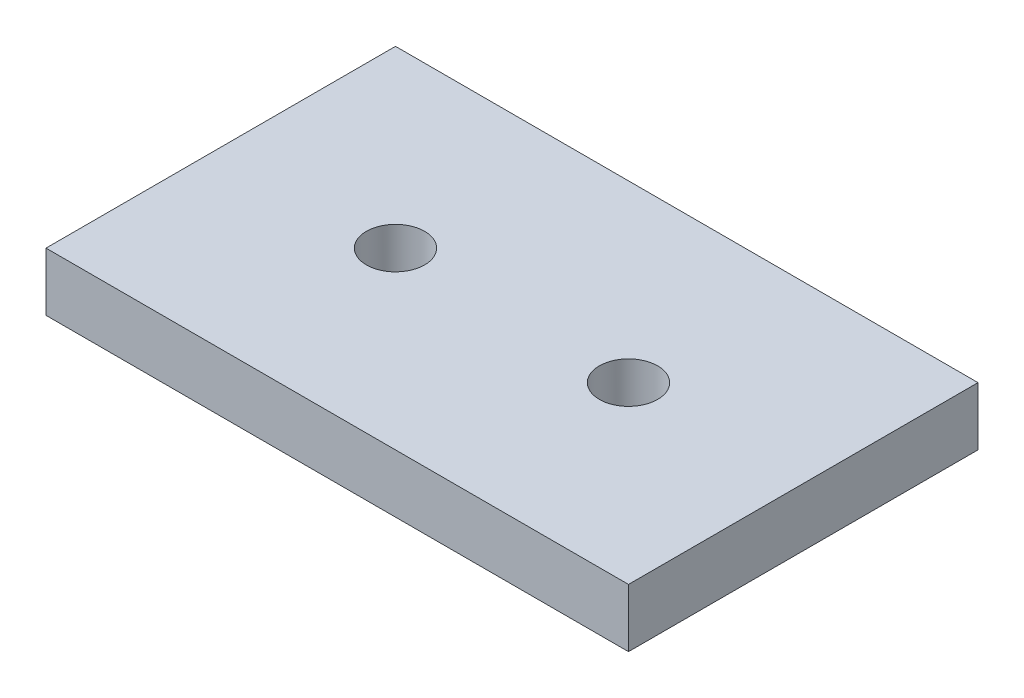
ISO-10303-21;
HEADER;
FILE_DESCRIPTION(('STEP AP214'),'2;1');
FILE_NAME('part.step','',(''),(''),'','','');
FILE_SCHEMA(('AUTOMOTIVE_DESIGN { 1 0 10303 214 1 1 1 1 }'));
ENDSEC;
DATA;
#1=APPLICATION_CONTEXT('core data for automotive mechanical design processes');
#2=APPLICATION_PROTOCOL_DEFINITION('international standard','automotive_design',2000,#1);
#3=PRODUCT_CONTEXT('',#1,'mechanical');
#4=PRODUCT('Part','Part','',(#3));
#5=PRODUCT_RELATED_PRODUCT_CATEGORY('part','',(#4));
#6=PRODUCT_DEFINITION_FORMATION('','',#4);
#7=PRODUCT_DEFINITION_CONTEXT('part definition',#1,'design');
#8=PRODUCT_DEFINITION('design','',#6,#7);
#9=PRODUCT_DEFINITION_SHAPE('','',#8);
#10=(LENGTH_UNIT() NAMED_UNIT(*) SI_UNIT(.MILLI.,.METRE.));
#11=(NAMED_UNIT(*) PLANE_ANGLE_UNIT() SI_UNIT($,.RADIAN.));
#12=(NAMED_UNIT(*) SI_UNIT($,.STERADIAN.) SOLID_ANGLE_UNIT());
#13=UNCERTAINTY_MEASURE_WITH_UNIT(LENGTH_MEASURE(1.E-05),#10,'distance_accuracy_value','');
#14=(GEOMETRIC_REPRESENTATION_CONTEXT(3) GLOBAL_UNCERTAINTY_ASSIGNED_CONTEXT((#13)) GLOBAL_UNIT_ASSIGNED_CONTEXT((#10,
#11,#12)) REPRESENTATION_CONTEXT('',''));
#15=CARTESIAN_POINT('',(0.,0.,0.));
#16=DIRECTION('',(0.,0.,1.));
#17=DIRECTION('',(1.,0.,0.));
#18=AXIS2_PLACEMENT_3D('',#15,#16,#17);
#19=CARTESIAN_POINT('',(50.,10.,30.));
#20=DIRECTION('',(-1.,0.,0.));
#21=DIRECTION('',(0.,0.,1.));
#22=AXIS2_PLACEMENT_3D('',#19,#20,#21);
#23=PLANE('',#22);
#24=DIRECTION('',(0.,0.,-1.));
#25=VECTOR('',#24,1.);
#26=CARTESIAN_POINT('',(50.,0.,30.));
#27=LINE('',#26,#25);
#28=CARTESIAN_POINT('',(50.,0.,30.));
#29=VERTEX_POINT('',#28);
#30=CARTESIAN_POINT('',(50.,0.,-30.));
#31=VERTEX_POINT('',#30);
#32=EDGE_CURVE('E102',#29,#31,#27,.T.);
#33=ORIENTED_EDGE('',*,*,#32,.T.);
#34=DIRECTION('',(0.,-1.,0.));
#35=VECTOR('',#34,1.);
#36=CARTESIAN_POINT('',(50.,10.,-30.));
#37=LINE('',#36,#35);
#38=CARTESIAN_POINT('',(50.,10.,-30.));
#39=VERTEX_POINT('',#38);
#40=EDGE_CURVE('E11',#39,#31,#37,.T.);
#41=ORIENTED_EDGE('',*,*,#40,.F.);
#42=DIRECTION('',(0.,0.,-1.));
#43=VECTOR('',#42,1.);
#44=CARTESIAN_POINT('',(50.,10.,30.));
#45=LINE('',#44,#43);
#46=CARTESIAN_POINT('',(50.,10.,30.));
#47=VERTEX_POINT('',#46);
#48=EDGE_CURVE('E90',#47,#39,#45,.T.);
#49=ORIENTED_EDGE('',*,*,#48,.F.);
#50=DIRECTION('',(0.,-1.,0.));
#51=VECTOR('',#50,1.);
#52=CARTESIAN_POINT('',(50.,10.,30.));
#53=LINE('',#52,#51);
#54=EDGE_CURVE('E98',#47,#29,#53,.T.);
#55=ORIENTED_EDGE('',*,*,#54,.T.);
#56=EDGE_LOOP('',(#33,#41,#49,#55));
#57=FACE_BOUND('',#56,.T.);
#58=ADVANCED_FACE('F39',(#57),#23,.F.);
#59=CARTESIAN_POINT('',(-50.,10.,-30.));
#60=DIRECTION('',(0.,0.,1.));
#61=DIRECTION('',(1.,0.,0.));
#62=AXIS2_PLACEMENT_3D('',#59,#60,#61);
#63=PLANE('',#62);
#64=DIRECTION('',(-1.,0.,0.));
#65=VECTOR('',#64,1.);
#66=CARTESIAN_POINT('',(-50.,0.,-30.));
#67=LINE('',#66,#65);
#68=CARTESIAN_POINT('',(-50.,0.,-30.));
#69=VERTEX_POINT('',#68);
#70=EDGE_CURVE('E94',#31,#69,#67,.T.);
#71=ORIENTED_EDGE('',*,*,#70,.T.);
#72=DIRECTION('',(0.,-1.,0.));
#73=VECTOR('',#72,1.);
#74=CARTESIAN_POINT('',(-50.,10.,-30.));
#75=LINE('',#74,#73);
#76=CARTESIAN_POINT('',(-50.,10.,-30.));
#77=VERTEX_POINT('',#76);
#78=EDGE_CURVE('E47',#77,#69,#75,.T.);
#79=ORIENTED_EDGE('',*,*,#78,.F.);
#80=DIRECTION('',(-1.,0.,0.));
#81=VECTOR('',#80,1.);
#82=CARTESIAN_POINT('',(-50.,10.,-30.));
#83=LINE('',#82,#81);
#84=EDGE_CURVE('E85',#39,#77,#83,.T.);
#85=ORIENTED_EDGE('',*,*,#84,.F.);
#86=ORIENTED_EDGE('',*,*,#40,.T.);
#87=EDGE_LOOP('',(#71,#79,#85,#86));
#88=FACE_BOUND('',#87,.T.);
#89=ADVANCED_FACE('F93',(#88),#63,.F.);
#90=CARTESIAN_POINT('',(-50.,10.,30.));
#91=DIRECTION('',(1.,0.,0.));
#92=DIRECTION('',(0.,0.,-1.));
#93=AXIS2_PLACEMENT_3D('',#90,#91,#92);
#94=PLANE('',#93);
#95=DIRECTION('',(0.,0.,1.));
#96=VECTOR('',#95,1.);
#97=CARTESIAN_POINT('',(-50.,0.,30.));
#98=LINE('',#97,#96);
#99=CARTESIAN_POINT('',(-50.,0.,30.));
#100=VERTEX_POINT('',#99);
#101=EDGE_CURVE('E72',#69,#100,#98,.T.);
#102=ORIENTED_EDGE('',*,*,#101,.T.);
#103=DIRECTION('',(0.,-1.,0.));
#104=VECTOR('',#103,1.);
#105=CARTESIAN_POINT('',(-50.,10.,30.));
#106=LINE('',#105,#104);
#107=CARTESIAN_POINT('',(-50.,10.,30.));
#108=VERTEX_POINT('',#107);
#109=EDGE_CURVE('E95',#108,#100,#106,.T.);
#110=ORIENTED_EDGE('',*,*,#109,.F.);
#111=DIRECTION('',(0.,0.,1.));
#112=VECTOR('',#111,1.);
#113=CARTESIAN_POINT('',(-50.,10.,30.));
#114=LINE('',#113,#112);
#115=EDGE_CURVE('E88',#77,#108,#114,.T.);
#116=ORIENTED_EDGE('',*,*,#115,.F.);
#117=ORIENTED_EDGE('',*,*,#78,.T.);
#118=EDGE_LOOP('',(#102,#110,#116,#117));
#119=FACE_BOUND('',#118,.T.);
#120=ADVANCED_FACE('F96',(#119),#94,.F.);
#121=CARTESIAN_POINT('',(-50.,10.,30.));
#122=DIRECTION('',(0.,0.,-1.));
#123=DIRECTION('',(-1.,0.,0.));
#124=AXIS2_PLACEMENT_3D('',#121,#122,#123);
#125=PLANE('',#124);
#126=DIRECTION('',(1.,0.,0.));
#127=VECTOR('',#126,1.);
#128=CARTESIAN_POINT('',(-50.,0.,30.));
#129=LINE('',#128,#127);
#130=EDGE_CURVE('E78',#100,#29,#129,.T.);
#131=ORIENTED_EDGE('',*,*,#130,.T.);
#132=ORIENTED_EDGE('',*,*,#54,.F.);
#133=DIRECTION('',(1.,0.,0.));
#134=VECTOR('',#133,1.);
#135=CARTESIAN_POINT('',(-50.,10.,30.));
#136=LINE('',#135,#134);
#137=EDGE_CURVE('E55',#108,#47,#136,.T.);
#138=ORIENTED_EDGE('',*,*,#137,.F.);
#139=ORIENTED_EDGE('',*,*,#109,.T.);
#140=EDGE_LOOP('',(#131,#132,#138,#139));
#141=FACE_BOUND('',#140,.T.);
#142=ADVANCED_FACE('F110',(#141),#125,.F.);
#143=CARTESIAN_POINT('',(0.,10.,0.));
#144=DIRECTION('',(0.,-1.,0.));
#145=DIRECTION('',(0.,0.,-1.));
#146=AXIS2_PLACEMENT_3D('',#143,#144,#145);
#147=PLANE('',#146);
#148=CARTESIAN_POINT('',(20.,10.,0.));
#149=DIRECTION('',(0.,-1.,0.));
#150=DIRECTION('',(0.,0.,-1.));
#151=AXIS2_PLACEMENT_3D('',#148,#149,#150);
#152=CIRCLE('',#151,5.);
#153=CARTESIAN_POINT('',(20.,10.,-5.));
#154=VERTEX_POINT('',#153);
#155=EDGE_CURVE('E121',#154,#154,#152,.F.);
#156=ORIENTED_EDGE('',*,*,#155,.F.);
#157=EDGE_LOOP('',(#156));
#158=FACE_BOUND('',#157,.T.);
#159=CARTESIAN_POINT('',(-20.,10.,0.));
#160=DIRECTION('',(0.,-1.,0.));
#161=DIRECTION('',(0.,0.,-1.));
#162=AXIS2_PLACEMENT_3D('',#159,#160,#161);
#163=CIRCLE('',#162,5.);
#164=CARTESIAN_POINT('',(-20.,10.,-5.));
#165=VERTEX_POINT('',#164);
#166=EDGE_CURVE('E105',#165,#165,#163,.F.);
#167=ORIENTED_EDGE('',*,*,#166,.F.);
#168=EDGE_LOOP('',(#167));
#169=FACE_BOUND('',#168,.T.);
#170=ORIENTED_EDGE('',*,*,#48,.T.);
#171=ORIENTED_EDGE('',*,*,#84,.T.);
#172=ORIENTED_EDGE('',*,*,#115,.T.);
#173=ORIENTED_EDGE('',*,*,#137,.T.);
#174=EDGE_LOOP('',(#170,#171,#172,#173));
#175=FACE_BOUND('',#174,.T.);
#176=ADVANCED_FACE('F86',(#158,#169,#175),#147,.F.);
#177=CARTESIAN_POINT('',(0.,0.,0.));
#178=DIRECTION('',(0.,-1.,0.));
#179=DIRECTION('',(0.,0.,-1.));
#180=AXIS2_PLACEMENT_3D('',#177,#178,#179);
#181=PLANE('',#180);
#182=CARTESIAN_POINT('',(20.,0.,0.));
#183=DIRECTION('',(0.,1.,0.));
#184=DIRECTION('',(0.,0.,1.));
#185=AXIS2_PLACEMENT_3D('',#182,#183,#184);
#186=CIRCLE('',#185,5.);
#187=CARTESIAN_POINT('',(20.,0.,5.));
#188=VERTEX_POINT('',#187);
#189=EDGE_CURVE('E124',#188,#188,#186,.T.);
#190=ORIENTED_EDGE('',*,*,#189,.T.);
#191=EDGE_LOOP('',(#190));
#192=FACE_BOUND('',#191,.T.);
#193=CARTESIAN_POINT('',(-20.,0.,0.));
#194=DIRECTION('',(0.,1.,0.));
#195=DIRECTION('',(0.,0.,1.));
#196=AXIS2_PLACEMENT_3D('',#193,#194,#195);
#197=CIRCLE('',#196,5.);
#198=CARTESIAN_POINT('',(-20.,0.,5.));
#199=VERTEX_POINT('',#198);
#200=EDGE_CURVE('E118',#199,#199,#197,.T.);
#201=ORIENTED_EDGE('',*,*,#200,.T.);
#202=EDGE_LOOP('',(#201));
#203=FACE_BOUND('',#202,.T.);
#204=ORIENTED_EDGE('',*,*,#32,.F.);
#205=ORIENTED_EDGE('',*,*,#130,.F.);
#206=ORIENTED_EDGE('',*,*,#101,.F.);
#207=ORIENTED_EDGE('',*,*,#70,.F.);
#208=EDGE_LOOP('',(#204,#205,#206,#207));
#209=FACE_BOUND('',#208,.T.);
#210=ADVANCED_FACE('F113',(#192,#203,#209),#181,.T.);
#211=CARTESIAN_POINT('',(-20.,20.,0.));
#212=DIRECTION('',(0.,-1.,0.));
#213=DIRECTION('',(0.,0.,-1.));
#214=AXIS2_PLACEMENT_3D('',#211,#212,#213);
#215=CYLINDRICAL_SURFACE('',#214,5.);
#216=ORIENTED_EDGE('',*,*,#200,.F.);
#217=EDGE_LOOP('',(#216));
#218=FACE_BOUND('',#217,.T.);
#219=ORIENTED_EDGE('',*,*,#166,.T.);
#220=EDGE_LOOP('',(#219));
#221=FACE_BOUND('',#220,.T.);
#222=ADVANCED_FACE('F133',(#218,#221),#215,.F.);
#223=CARTESIAN_POINT('',(20.,20.,0.));
#224=DIRECTION('',(0.,-1.,0.));
#225=DIRECTION('',(0.,0.,-1.));
#226=AXIS2_PLACEMENT_3D('',#223,#224,#225);
#227=CYLINDRICAL_SURFACE('',#226,5.);
#228=ORIENTED_EDGE('',*,*,#189,.F.);
#229=EDGE_LOOP('',(#228));
#230=FACE_BOUND('',#229,.T.);
#231=ORIENTED_EDGE('',*,*,#155,.T.);
#232=EDGE_LOOP('',(#231));
#233=FACE_BOUND('',#232,.T.);
#234=ADVANCED_FACE('F130',(#230,#233),#227,.F.);
#235=CLOSED_SHELL('',(#58,#89,#120,#142,#176,#210,#222,#234));
#236=MANIFOLD_SOLID_BREP('B2',#235);
#237=ADVANCED_BREP_SHAPE_REPRESENTATION('',(#18,#236),#14);
#238=SHAPE_DEFINITION_REPRESENTATION(#9,#237);
ENDSEC;
END-ISO-10303-21;
